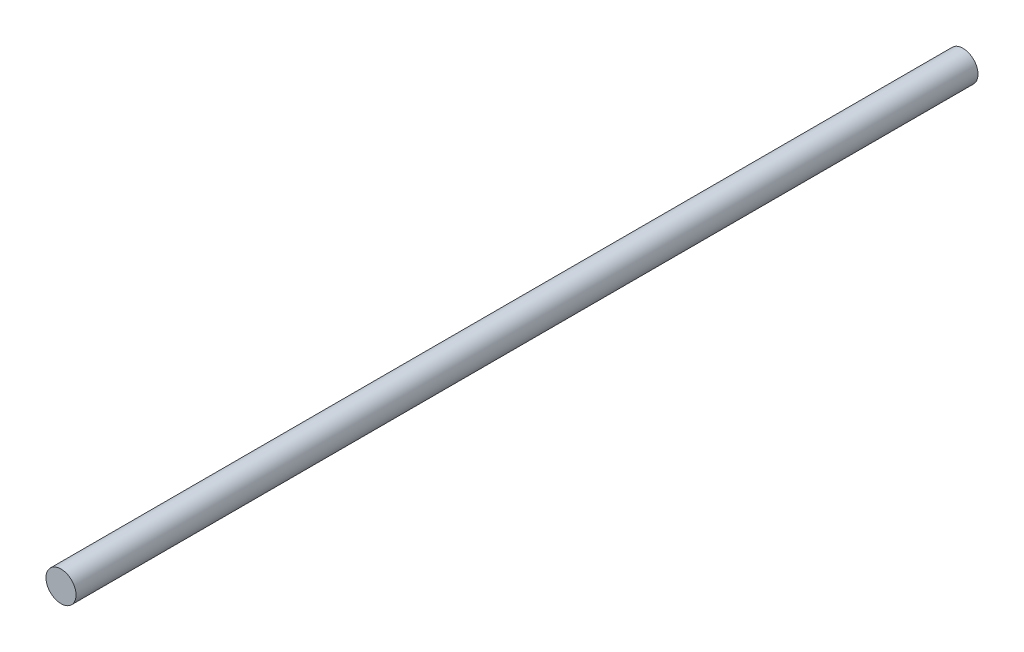
ISO-10303-21;
HEADER;
FILE_DESCRIPTION(('STEP AP214'),'2;1');
FILE_NAME('part.step','',(''),(''),'','','');
FILE_SCHEMA(('AUTOMOTIVE_DESIGN { 1 0 10303 214 1 1 1 1 }'));
ENDSEC;
DATA;
#1=APPLICATION_CONTEXT('core data for automotive mechanical design processes');
#2=APPLICATION_PROTOCOL_DEFINITION('international standard','automotive_design',2000,#1);
#3=PRODUCT_CONTEXT('',#1,'mechanical');
#4=PRODUCT('Part','Part','',(#3));
#5=PRODUCT_RELATED_PRODUCT_CATEGORY('part','',(#4));
#6=PRODUCT_DEFINITION_FORMATION('','',#4);
#7=PRODUCT_DEFINITION_CONTEXT('part definition',#1,'design');
#8=PRODUCT_DEFINITION('design','',#6,#7);
#9=PRODUCT_DEFINITION_SHAPE('','',#8);
#10=(LENGTH_UNIT() NAMED_UNIT(*) SI_UNIT(.MILLI.,.METRE.));
#11=(NAMED_UNIT(*) PLANE_ANGLE_UNIT() SI_UNIT($,.RADIAN.));
#12=(NAMED_UNIT(*) SI_UNIT($,.STERADIAN.) SOLID_ANGLE_UNIT());
#13=UNCERTAINTY_MEASURE_WITH_UNIT(LENGTH_MEASURE(1.E-05),#10,'distance_accuracy_value','');
#14=(GEOMETRIC_REPRESENTATION_CONTEXT(3) GLOBAL_UNCERTAINTY_ASSIGNED_CONTEXT((#13)) GLOBAL_UNIT_ASSIGNED_CONTEXT((#10,
#11,#12)) REPRESENTATION_CONTEXT('',''));
#15=CARTESIAN_POINT('',(0.,0.,0.));
#16=DIRECTION('',(0.,0.,1.));
#17=DIRECTION('',(1.,0.,0.));
#18=AXIS2_PLACEMENT_3D('',#15,#16,#17);
#19=CARTESIAN_POINT('',(0.,0.,-120.));
#20=DIRECTION('',(0.,0.,1.));
#21=DIRECTION('',(1.,0.,0.));
#22=AXIS2_PLACEMENT_3D('',#19,#20,#21);
#23=CYLINDRICAL_SURFACE('',#22,4.);
#24=CARTESIAN_POINT('',(0.,0.,-120.));
#25=DIRECTION('',(0.,0.,1.));
#26=DIRECTION('',(1.,0.,0.));
#27=AXIS2_PLACEMENT_3D('',#24,#25,#26);
#28=CIRCLE('',#27,4.);
#29=CARTESIAN_POINT('',(4.,0.,-120.));
#30=VERTEX_POINT('',#29);
#31=EDGE_CURVE('E10',#30,#30,#28,.T.);
#32=ORIENTED_EDGE('',*,*,#31,.T.);
#33=EDGE_LOOP('',(#32));
#34=FACE_BOUND('',#33,.T.);
#35=CARTESIAN_POINT('',(0.,0.,120.));
#36=DIRECTION('',(0.,0.,1.));
#37=DIRECTION('',(1.,0.,0.));
#38=AXIS2_PLACEMENT_3D('',#35,#36,#37);
#39=CIRCLE('',#38,4.);
#40=CARTESIAN_POINT('',(4.,0.,120.));
#41=VERTEX_POINT('',#40);
#42=EDGE_CURVE('E40',#41,#41,#39,.T.);
#43=ORIENTED_EDGE('',*,*,#42,.F.);
#44=EDGE_LOOP('',(#43));
#45=FACE_BOUND('',#44,.T.);
#46=ADVANCED_FACE('F37',(#34,#45),#23,.T.);
#47=CARTESIAN_POINT('',(0.,0.,-120.));
#48=DIRECTION('',(0.,0.,1.));
#49=DIRECTION('',(1.,0.,0.));
#50=AXIS2_PLACEMENT_3D('',#47,#48,#49);
#51=PLANE('',#50);
#52=ORIENTED_EDGE('',*,*,#31,.F.);
#53=EDGE_LOOP('',(#52));
#54=FACE_BOUND('',#53,.T.);
#55=ADVANCED_FACE('F54',(#54),#51,.F.);
#56=CARTESIAN_POINT('',(0.,0.,120.));
#57=DIRECTION('',(0.,0.,1.));
#58=DIRECTION('',(1.,0.,0.));
#59=AXIS2_PLACEMENT_3D('',#56,#57,#58);
#60=PLANE('',#59);
#61=ORIENTED_EDGE('',*,*,#42,.T.);
#62=EDGE_LOOP('',(#61));
#63=FACE_BOUND('',#62,.T.);
#64=ADVANCED_FACE('F51',(#63),#60,.T.);
#65=CLOSED_SHELL('',(#46,#55,#64));
#66=MANIFOLD_SOLID_BREP('B2',#65);
#67=ADVANCED_BREP_SHAPE_REPRESENTATION('',(#18,#66),#14);
#68=SHAPE_DEFINITION_REPRESENTATION(#9,#67);
ENDSEC;
END-ISO-10303-21;
